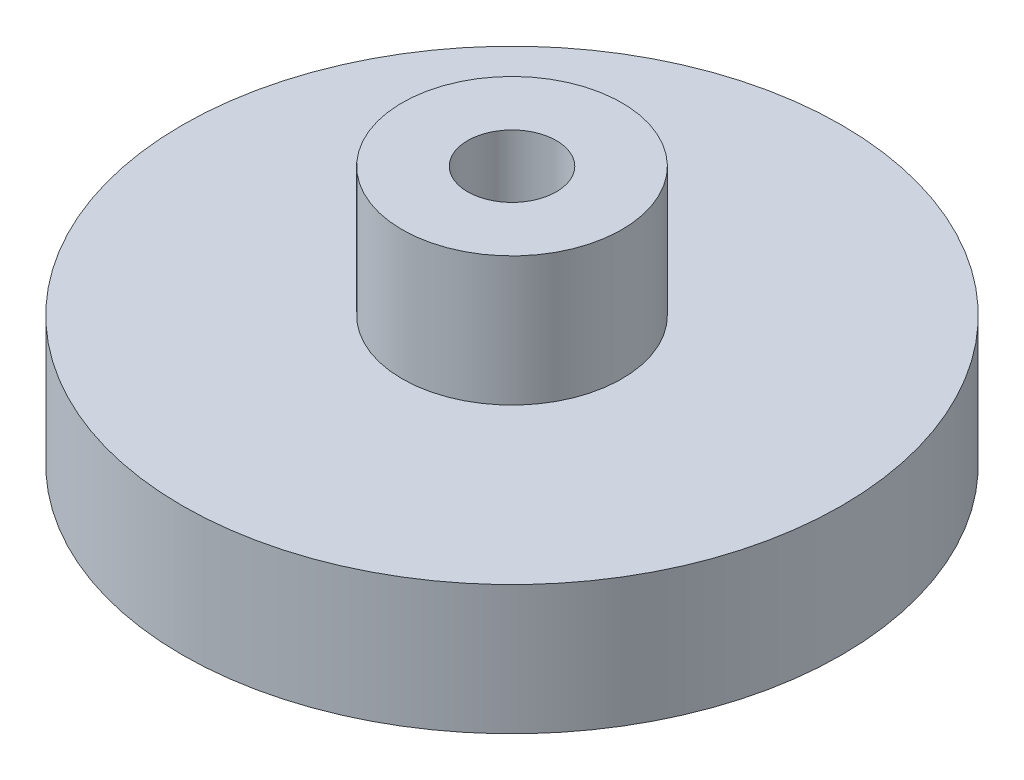
ISO-10303-21;
HEADER;
FILE_DESCRIPTION(('STEP AP214'),'2;1');
FILE_NAME('part.step','',(''),(''),'','','');
FILE_SCHEMA(('AUTOMOTIVE_DESIGN { 1 0 10303 214 1 1 1 1 }'));
ENDSEC;
DATA;
#1=APPLICATION_CONTEXT('core data for automotive mechanical design processes');
#2=APPLICATION_PROTOCOL_DEFINITION('international standard','automotive_design',2000,#1);
#3=PRODUCT_CONTEXT('',#1,'mechanical');
#4=PRODUCT('Part','Part','',(#3));
#5=PRODUCT_RELATED_PRODUCT_CATEGORY('part','',(#4));
#6=PRODUCT_DEFINITION_FORMATION('','',#4);
#7=PRODUCT_DEFINITION_CONTEXT('part definition',#1,'design');
#8=PRODUCT_DEFINITION('design','',#6,#7);
#9=PRODUCT_DEFINITION_SHAPE('','',#8);
#10=(LENGTH_UNIT() NAMED_UNIT(*) SI_UNIT(.MILLI.,.METRE.));
#11=(NAMED_UNIT(*) PLANE_ANGLE_UNIT() SI_UNIT($,.RADIAN.));
#12=(NAMED_UNIT(*) SI_UNIT($,.STERADIAN.) SOLID_ANGLE_UNIT());
#13=UNCERTAINTY_MEASURE_WITH_UNIT(LENGTH_MEASURE(1.E-05),#10,'distance_accuracy_value','');
#14=(GEOMETRIC_REPRESENTATION_CONTEXT(3) GLOBAL_UNCERTAINTY_ASSIGNED_CONTEXT((#13)) GLOBAL_UNIT_ASSIGNED_CONTEXT((#10,
#11,#12)) REPRESENTATION_CONTEXT('',''));
#15=CARTESIAN_POINT('',(0.,0.,0.));
#16=DIRECTION('',(0.,0.,1.));
#17=DIRECTION('',(1.,0.,0.));
#18=AXIS2_PLACEMENT_3D('',#15,#16,#17);
#19=CARTESIAN_POINT('',(0.,5.82,0.));
#20=DIRECTION('',(0.,1.,0.));
#21=DIRECTION('',(0.,0.,1.));
#22=AXIS2_PLACEMENT_3D('',#19,#20,#21);
#23=PLANE('',#22);
#24=CARTESIAN_POINT('',(0.,5.82,0.));
#25=DIRECTION('',(0.,1.,0.));
#26=DIRECTION('',(0.,0.,1.));
#27=AXIS2_PLACEMENT_3D('',#24,#25,#26);
#28=CIRCLE('',#27,14.85);
#29=CARTESIAN_POINT('',(0.,5.82,14.85));
#30=VERTEX_POINT('',#29);
#31=EDGE_CURVE('E10',#30,#30,#28,.T.);
#32=ORIENTED_EDGE('',*,*,#31,.T.);
#33=EDGE_LOOP('',(#32));
#34=FACE_BOUND('',#33,.T.);
#35=CARTESIAN_POINT('',(0.,5.82,0.));
#36=DIRECTION('',(0.,1.,0.));
#37=DIRECTION('',(0.,0.,1.));
#38=AXIS2_PLACEMENT_3D('',#35,#36,#37);
#39=CIRCLE('',#38,4.95);
#40=CARTESIAN_POINT('',(0.,5.82,4.95));
#41=VERTEX_POINT('',#40);
#42=EDGE_CURVE('E53',#41,#41,#39,.T.);
#43=ORIENTED_EDGE('',*,*,#42,.F.);
#44=EDGE_LOOP('',(#43));
#45=FACE_BOUND('',#44,.T.);
#46=ADVANCED_FACE('F37',(#34,#45),#23,.T.);
#47=CARTESIAN_POINT('',(0.,0.,0.));
#48=DIRECTION('',(0.,1.,0.));
#49=DIRECTION('',(0.,0.,1.));
#50=AXIS2_PLACEMENT_3D('',#47,#48,#49);
#51=PLANE('',#50);
#52=CARTESIAN_POINT('',(0.,0.,0.));
#53=DIRECTION('',(0.,1.,0.));
#54=DIRECTION('',(0.,0.,1.));
#55=AXIS2_PLACEMENT_3D('',#52,#53,#54);
#56=CIRCLE('',#55,14.85);
#57=CARTESIAN_POINT('',(0.,0.,14.85));
#58=VERTEX_POINT('',#57);
#59=EDGE_CURVE('E41',#58,#58,#56,.T.);
#60=ORIENTED_EDGE('',*,*,#59,.F.);
#61=EDGE_LOOP('',(#60));
#62=FACE_BOUND('',#61,.T.);
#63=CARTESIAN_POINT('',(0.,0.,0.));
#64=DIRECTION('',(0.,1.,0.));
#65=DIRECTION('',(0.,0.,1.));
#66=AXIS2_PLACEMENT_3D('',#63,#64,#65);
#67=CIRCLE('',#66,2.);
#68=CARTESIAN_POINT('',(0.,0.,2.));
#69=VERTEX_POINT('',#68);
#70=EDGE_CURVE('E48',#69,#69,#67,.T.);
#71=ORIENTED_EDGE('',*,*,#70,.T.);
#72=EDGE_LOOP('',(#71));
#73=FACE_BOUND('',#72,.T.);
#74=ADVANCED_FACE('F78',(#62,#73),#51,.F.);
#75=CARTESIAN_POINT('',(0.,5.82,0.));
#76=DIRECTION('',(0.,-1.,0.));
#77=DIRECTION('',(0.,0.,-1.));
#78=AXIS2_PLACEMENT_3D('',#75,#76,#77);
#79=CYLINDRICAL_SURFACE('',#78,14.85);
#80=ORIENTED_EDGE('',*,*,#31,.F.);
#81=EDGE_LOOP('',(#80));
#82=FACE_BOUND('',#81,.T.);
#83=ORIENTED_EDGE('',*,*,#59,.T.);
#84=EDGE_LOOP('',(#83));
#85=FACE_BOUND('',#84,.T.);
#86=ADVANCED_FACE('F39',(#82,#85),#79,.T.);
#87=CARTESIAN_POINT('',(0.,5.82,0.));
#88=DIRECTION('',(0.,-1.,0.));
#89=DIRECTION('',(0.,0.,-1.));
#90=AXIS2_PLACEMENT_3D('',#87,#88,#89);
#91=CYLINDRICAL_SURFACE('',#90,2.);
#92=ORIENTED_EDGE('',*,*,#70,.F.);
#93=EDGE_LOOP('',(#92));
#94=FACE_BOUND('',#93,.T.);
#95=CARTESIAN_POINT('',(0.,11.64,0.));
#96=DIRECTION('',(0.,1.,0.));
#97=DIRECTION('',(0.,0.,1.));
#98=AXIS2_PLACEMENT_3D('',#95,#96,#97);
#99=CIRCLE('',#98,2.);
#100=CARTESIAN_POINT('',(0.,11.64,2.));
#101=VERTEX_POINT('',#100);
#102=EDGE_CURVE('E56',#101,#101,#99,.T.);
#103=ORIENTED_EDGE('',*,*,#102,.T.);
#104=EDGE_LOOP('',(#103));
#105=FACE_BOUND('',#104,.T.);
#106=ADVANCED_FACE('F62',(#94,#105),#91,.F.);
#107=CARTESIAN_POINT('',(0.,11.64,0.));
#108=DIRECTION('',(0.,1.,0.));
#109=DIRECTION('',(0.,0.,1.));
#110=AXIS2_PLACEMENT_3D('',#107,#108,#109);
#111=PLANE('',#110);
#112=CARTESIAN_POINT('',(0.,11.64,0.));
#113=DIRECTION('',(0.,1.,0.));
#114=DIRECTION('',(0.,0.,1.));
#115=AXIS2_PLACEMENT_3D('',#112,#113,#114);
#116=CIRCLE('',#115,4.95);
#117=CARTESIAN_POINT('',(0.,11.64,4.95));
#118=VERTEX_POINT('',#117);
#119=EDGE_CURVE('E52',#118,#118,#116,.T.);
#120=ORIENTED_EDGE('',*,*,#119,.T.);
#121=EDGE_LOOP('',(#120));
#122=FACE_BOUND('',#121,.T.);
#123=ORIENTED_EDGE('',*,*,#102,.F.);
#124=EDGE_LOOP('',(#123));
#125=FACE_BOUND('',#124,.T.);
#126=ADVANCED_FACE('F64',(#122,#125),#111,.T.);
#127=CARTESIAN_POINT('',(0.,11.64,0.));
#128=DIRECTION('',(0.,-1.,0.));
#129=DIRECTION('',(0.,0.,-1.));
#130=AXIS2_PLACEMENT_3D('',#127,#128,#129);
#131=CYLINDRICAL_SURFACE('',#130,4.95);
#132=ORIENTED_EDGE('',*,*,#119,.F.);
#133=EDGE_LOOP('',(#132));
#134=FACE_BOUND('',#133,.T.);
#135=ORIENTED_EDGE('',*,*,#42,.T.);
#136=EDGE_LOOP('',(#135));
#137=FACE_BOUND('',#136,.T.);
#138=ADVANCED_FACE('F66',(#134,#137),#131,.T.);
#139=CLOSED_SHELL('',(#46,#74,#86,#106,#126,#138));
#140=MANIFOLD_SOLID_BREP('B2',#139);
#141=ADVANCED_BREP_SHAPE_REPRESENTATION('',(#18,#140),#14);
#142=SHAPE_DEFINITION_REPRESENTATION(#9,#141);
ENDSEC;
END-ISO-10303-21;
